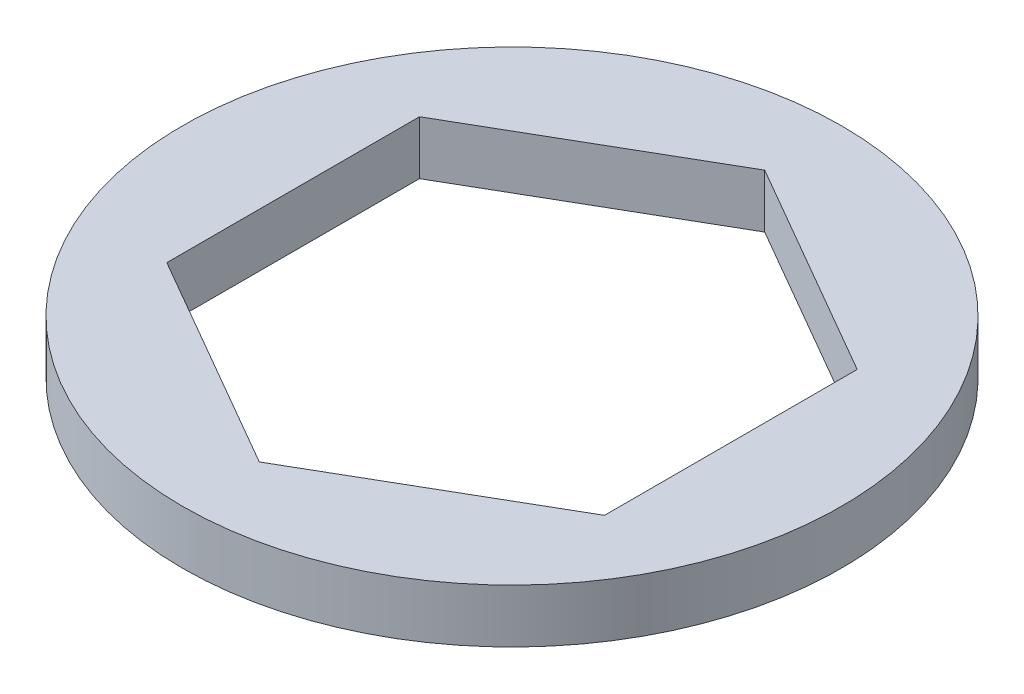
ISO-10303-21;
HEADER;
FILE_DESCRIPTION(('STEP AP214'),'2;1');
FILE_NAME('part.step','',(''),(''),'','','');
FILE_SCHEMA(('AUTOMOTIVE_DESIGN { 1 0 10303 214 1 1 1 1 }'));
ENDSEC;
DATA;
#1=APPLICATION_CONTEXT('core data for automotive mechanical design processes');
#2=APPLICATION_PROTOCOL_DEFINITION('international standard','automotive_design',2000,#1);
#3=PRODUCT_CONTEXT('',#1,'mechanical');
#4=PRODUCT('Part','Part','',(#3));
#5=PRODUCT_RELATED_PRODUCT_CATEGORY('part','',(#4));
#6=PRODUCT_DEFINITION_FORMATION('','',#4);
#7=PRODUCT_DEFINITION_CONTEXT('part definition',#1,'design');
#8=PRODUCT_DEFINITION('design','',#6,#7);
#9=PRODUCT_DEFINITION_SHAPE('','',#8);
#10=(LENGTH_UNIT() NAMED_UNIT(*) SI_UNIT(.MILLI.,.METRE.));
#11=(NAMED_UNIT(*) PLANE_ANGLE_UNIT() SI_UNIT($,.RADIAN.));
#12=(NAMED_UNIT(*) SI_UNIT($,.STERADIAN.) SOLID_ANGLE_UNIT());
#13=UNCERTAINTY_MEASURE_WITH_UNIT(LENGTH_MEASURE(1.E-05),#10,'distance_accuracy_value','');
#14=(GEOMETRIC_REPRESENTATION_CONTEXT(3) GLOBAL_UNCERTAINTY_ASSIGNED_CONTEXT((#13)) GLOBAL_UNIT_ASSIGNED_CONTEXT((#10,
#11,#12)) REPRESENTATION_CONTEXT('',''));
#15=CARTESIAN_POINT('',(0.,0.,0.));
#16=DIRECTION('',(0.,0.,1.));
#17=DIRECTION('',(1.,0.,0.));
#18=AXIS2_PLACEMENT_3D('',#15,#16,#17);
#19=CARTESIAN_POINT('',(0.,1.5875,0.));
#20=DIRECTION('',(0.,1.,0.));
#21=DIRECTION('',(0.,0.,1.));
#22=AXIS2_PLACEMENT_3D('',#19,#20,#21);
#23=PLANE('',#22);
#24=CARTESIAN_POINT('',(0.,1.5875,0.));
#25=DIRECTION('',(0.,1.,0.));
#26=DIRECTION('',(0.,0.,1.));
#27=AXIS2_PLACEMENT_3D('',#24,#25,#26);
#28=CIRCLE('',#27,9.7536);
#29=CARTESIAN_POINT('',(0.,1.5875,9.7536));
#30=VERTEX_POINT('',#29);
#31=EDGE_CURVE('E11',#30,#30,#28,.T.);
#32=ORIENTED_EDGE('',*,*,#31,.T.);
#33=EDGE_LOOP('',(#32));
#34=FACE_BOUND('',#33,.T.);
#35=DIRECTION('',(-0.866025403784438,0.,0.500000000000001));
#36=VECTOR('',#35,1.);
#37=CARTESIAN_POINT('',(0.,1.5875,-7.4789953870824));
#38=LINE('',#37,#36);
#39=CARTESIAN_POINT('',(0.,1.5875,-7.4789953870824));
#40=VERTEX_POINT('',#39);
#41=CARTESIAN_POINT('',(-6.477,1.5875,-3.73949769354119));
#42=VERTEX_POINT('',#41);
#43=EDGE_CURVE('E93',#40,#42,#38,.T.);
#44=ORIENTED_EDGE('',*,*,#43,.F.);
#45=DIRECTION('',(-0.866025403784441,0.,-0.499999999999995));
#46=VECTOR('',#45,1.);
#47=CARTESIAN_POINT('',(6.47699999999995,1.5875,-3.73949769354128));
#48=LINE('',#47,#46);
#49=CARTESIAN_POINT('',(6.47699999999995,1.5875,-3.73949769354128));
#50=VERTEX_POINT('',#49);
#51=EDGE_CURVE('E85',#50,#40,#48,.T.);
#52=ORIENTED_EDGE('',*,*,#51,.F.);
#53=DIRECTION('',(0.,0.,-1.));
#54=VECTOR('',#53,1.);
#55=CARTESIAN_POINT('',(6.47700000000003,1.5875,3.73949769354114));
#56=LINE('',#55,#54);
#57=CARTESIAN_POINT('',(6.47700000000003,1.5875,3.73949769354114));
#58=VERTEX_POINT('',#57);
#59=EDGE_CURVE('E113',#58,#50,#56,.T.);
#60=ORIENTED_EDGE('',*,*,#59,.F.);
#61=DIRECTION('',(0.866025403784434,0.,-0.500000000000007));
#62=VECTOR('',#61,1.);
#63=CARTESIAN_POINT('',(0.,1.5875,7.4789953870824));
#64=LINE('',#63,#62);
#65=CARTESIAN_POINT('',(0.,1.5875,7.4789953870824));
#66=VERTEX_POINT('',#65);
#67=EDGE_CURVE('E111',#66,#58,#64,.T.);
#68=ORIENTED_EDGE('',*,*,#67,.F.);
#69=DIRECTION('',(0.866025403784441,0.,0.499999999999995));
#70=VECTOR('',#69,1.);
#71=CARTESIAN_POINT('',(-6.47699999999997,1.5875,3.73949769354123));
#72=LINE('',#71,#70);
#73=CARTESIAN_POINT('',(-6.47699999999997,1.5875,3.73949769354123));
#74=VERTEX_POINT('',#73);
#75=EDGE_CURVE('E107',#74,#66,#72,.T.);
#76=ORIENTED_EDGE('',*,*,#75,.F.);
#77=DIRECTION('',(0.,0.,1.));
#78=VECTOR('',#77,1.);
#79=CARTESIAN_POINT('',(-6.477,1.5875,-3.73949769354119));
#80=LINE('',#79,#78);
#81=EDGE_CURVE('E105',#42,#74,#80,.T.);
#82=ORIENTED_EDGE('',*,*,#81,.F.);
#83=EDGE_LOOP('',(#44,#52,#60,#68,#76,#82));
#84=FACE_BOUND('',#83,.T.);
#85=ADVANCED_FACE('F32',(#34,#84),#23,.T.);
#86=CARTESIAN_POINT('',(0.,0.,0.));
#87=DIRECTION('',(0.,1.,0.));
#88=DIRECTION('',(0.,0.,1.));
#89=AXIS2_PLACEMENT_3D('',#86,#87,#88);
#90=PLANE('',#89);
#91=CARTESIAN_POINT('',(0.,0.,0.));
#92=DIRECTION('',(0.,1.,0.));
#93=DIRECTION('',(0.,0.,1.));
#94=AXIS2_PLACEMENT_3D('',#91,#92,#93);
#95=CIRCLE('',#94,9.7536);
#96=CARTESIAN_POINT('',(0.,0.,9.7536));
#97=VERTEX_POINT('',#96);
#98=EDGE_CURVE('E36',#97,#97,#95,.T.);
#99=ORIENTED_EDGE('',*,*,#98,.F.);
#100=EDGE_LOOP('',(#99));
#101=FACE_BOUND('',#100,.T.);
#102=DIRECTION('',(-0.866025403784441,0.,-0.499999999999995));
#103=VECTOR('',#102,1.);
#104=CARTESIAN_POINT('',(6.47699999999995,0.,-3.73949769354128));
#105=LINE('',#104,#103);
#106=CARTESIAN_POINT('',(6.47699999999995,0.,-3.73949769354128));
#107=VERTEX_POINT('',#106);
#108=CARTESIAN_POINT('',(0.,0.,-7.4789953870824));
#109=VERTEX_POINT('',#108);
#110=EDGE_CURVE('E55',#107,#109,#105,.T.);
#111=ORIENTED_EDGE('',*,*,#110,.T.);
#112=DIRECTION('',(-0.866025403784438,0.,0.500000000000001));
#113=VECTOR('',#112,1.);
#114=CARTESIAN_POINT('',(0.,0.,-7.4789953870824));
#115=LINE('',#114,#113);
#116=CARTESIAN_POINT('',(-6.477,0.,-3.73949769354119));
#117=VERTEX_POINT('',#116);
#118=EDGE_CURVE('E100',#109,#117,#115,.T.);
#119=ORIENTED_EDGE('',*,*,#118,.T.);
#120=DIRECTION('',(0.,0.,1.));
#121=VECTOR('',#120,1.);
#122=CARTESIAN_POINT('',(-6.477,0.,-3.73949769354119));
#123=LINE('',#122,#121);
#124=CARTESIAN_POINT('',(-6.47699999999997,0.,3.73949769354123));
#125=VERTEX_POINT('',#124);
#126=EDGE_CURVE('E117',#117,#125,#123,.T.);
#127=ORIENTED_EDGE('',*,*,#126,.T.);
#128=DIRECTION('',(0.866025403784441,0.,0.499999999999995));
#129=VECTOR('',#128,1.);
#130=CARTESIAN_POINT('',(-6.47699999999997,0.,3.73949769354123));
#131=LINE('',#130,#129);
#132=CARTESIAN_POINT('',(0.,0.,7.4789953870824));
#133=VERTEX_POINT('',#132);
#134=EDGE_CURVE('E120',#125,#133,#131,.T.);
#135=ORIENTED_EDGE('',*,*,#134,.T.);
#136=DIRECTION('',(0.866025403784434,0.,-0.500000000000007));
#137=VECTOR('',#136,1.);
#138=CARTESIAN_POINT('',(0.,0.,7.4789953870824));
#139=LINE('',#138,#137);
#140=CARTESIAN_POINT('',(6.47700000000003,0.,3.73949769354114));
#141=VERTEX_POINT('',#140);
#142=EDGE_CURVE('E123',#133,#141,#139,.T.);
#143=ORIENTED_EDGE('',*,*,#142,.T.);
#144=DIRECTION('',(0.,0.,-1.));
#145=VECTOR('',#144,1.);
#146=CARTESIAN_POINT('',(6.47700000000003,0.,3.73949769354114));
#147=LINE('',#146,#145);
#148=EDGE_CURVE('E94',#141,#107,#147,.T.);
#149=ORIENTED_EDGE('',*,*,#148,.T.);
#150=EDGE_LOOP('',(#111,#119,#127,#135,#143,#149));
#151=FACE_BOUND('',#150,.T.);
#152=ADVANCED_FACE('F140',(#101,#151),#90,.F.);
#153=CARTESIAN_POINT('',(0.,1.5875,0.));
#154=DIRECTION('',(0.,-1.,0.));
#155=DIRECTION('',(0.,0.,-1.));
#156=AXIS2_PLACEMENT_3D('',#153,#154,#155);
#157=CYLINDRICAL_SURFACE('',#156,9.7536);
#158=ORIENTED_EDGE('',*,*,#31,.F.);
#159=EDGE_LOOP('',(#158));
#160=FACE_BOUND('',#159,.T.);
#161=ORIENTED_EDGE('',*,*,#98,.T.);
#162=EDGE_LOOP('',(#161));
#163=FACE_BOUND('',#162,.T.);
#164=ADVANCED_FACE('F34',(#160,#163),#157,.T.);
#165=CARTESIAN_POINT('',(6.47699999999995,1.5875,-3.73949769354128));
#166=DIRECTION('',(-0.499999999999995,0.,0.866025403784442));
#167=DIRECTION('',(0.866025403784442,0.,0.499999999999995));
#168=AXIS2_PLACEMENT_3D('',#165,#166,#167);
#169=PLANE('',#168);
#170=ORIENTED_EDGE('',*,*,#110,.F.);
#171=DIRECTION('',(0.,-1.,0.));
#172=VECTOR('',#171,1.);
#173=CARTESIAN_POINT('',(6.47699999999995,1.5875,-3.73949769354128));
#174=LINE('',#173,#172);
#175=EDGE_CURVE('E89',#50,#107,#174,.T.);
#176=ORIENTED_EDGE('',*,*,#175,.F.);
#177=ORIENTED_EDGE('',*,*,#51,.T.);
#178=DIRECTION('',(0.,-1.,0.));
#179=VECTOR('',#178,1.);
#180=CARTESIAN_POINT('',(0.,1.5875,-7.4789953870824));
#181=LINE('',#180,#179);
#182=EDGE_CURVE('E88',#40,#109,#181,.T.);
#183=ORIENTED_EDGE('',*,*,#182,.T.);
#184=EDGE_LOOP('',(#170,#176,#177,#183));
#185=FACE_BOUND('',#184,.T.);
#186=ADVANCED_FACE('F87',(#185),#169,.T.);
#187=CARTESIAN_POINT('',(0.,1.5875,-7.4789953870824));
#188=DIRECTION('',(0.500000000000001,0.,0.866025403784438));
#189=DIRECTION('',(0.866025403784438,0.,-0.500000000000001));
#190=AXIS2_PLACEMENT_3D('',#187,#188,#189);
#191=PLANE('',#190);
#192=ORIENTED_EDGE('',*,*,#118,.F.);
#193=ORIENTED_EDGE('',*,*,#182,.F.);
#194=ORIENTED_EDGE('',*,*,#43,.T.);
#195=DIRECTION('',(0.,-1.,0.));
#196=VECTOR('',#195,1.);
#197=CARTESIAN_POINT('',(-6.477,1.5875,-3.73949769354119));
#198=LINE('',#197,#196);
#199=EDGE_CURVE('E101',#42,#117,#198,.T.);
#200=ORIENTED_EDGE('',*,*,#199,.T.);
#201=EDGE_LOOP('',(#192,#193,#194,#200));
#202=FACE_BOUND('',#201,.T.);
#203=ADVANCED_FACE('F97',(#202),#191,.T.);
#204=CARTESIAN_POINT('',(-6.477,1.5875,-3.73949769354119));
#205=DIRECTION('',(1.,0.,0.));
#206=DIRECTION('',(0.,0.,-1.));
#207=AXIS2_PLACEMENT_3D('',#204,#205,#206);
#208=PLANE('',#207);
#209=ORIENTED_EDGE('',*,*,#126,.F.);
#210=ORIENTED_EDGE('',*,*,#199,.F.);
#211=ORIENTED_EDGE('',*,*,#81,.T.);
#212=DIRECTION('',(0.,-1.,0.));
#213=VECTOR('',#212,1.);
#214=CARTESIAN_POINT('',(-6.47699999999997,1.5875,3.73949769354123));
#215=LINE('',#214,#213);
#216=EDGE_CURVE('E132',#74,#125,#215,.T.);
#217=ORIENTED_EDGE('',*,*,#216,.T.);
#218=EDGE_LOOP('',(#209,#210,#211,#217));
#219=FACE_BOUND('',#218,.T.);
#220=ADVANCED_FACE('F136',(#219),#208,.T.);
#221=CARTESIAN_POINT('',(-6.47699999999997,1.5875,3.73949769354123));
#222=DIRECTION('',(0.499999999999995,0.,-0.866025403784442));
#223=DIRECTION('',(-0.866025403784442,0.,-0.499999999999995));
#224=AXIS2_PLACEMENT_3D('',#221,#222,#223);
#225=PLANE('',#224);
#226=ORIENTED_EDGE('',*,*,#134,.F.);
#227=ORIENTED_EDGE('',*,*,#216,.F.);
#228=ORIENTED_EDGE('',*,*,#75,.T.);
#229=DIRECTION('',(0.,-1.,0.));
#230=VECTOR('',#229,1.);
#231=CARTESIAN_POINT('',(0.,1.5875,7.4789953870824));
#232=LINE('',#231,#230);
#233=EDGE_CURVE('E130',#66,#133,#232,.T.);
#234=ORIENTED_EDGE('',*,*,#233,.T.);
#235=EDGE_LOOP('',(#226,#227,#228,#234));
#236=FACE_BOUND('',#235,.T.);
#237=ADVANCED_FACE('F148',(#236),#225,.T.);
#238=CARTESIAN_POINT('',(0.,1.5875,7.4789953870824));
#239=DIRECTION('',(-0.500000000000007,0.,-0.866025403784435));
#240=DIRECTION('',(-0.866025403784435,0.,0.500000000000007));
#241=AXIS2_PLACEMENT_3D('',#238,#239,#240);
#242=PLANE('',#241);
#243=ORIENTED_EDGE('',*,*,#142,.F.);
#244=ORIENTED_EDGE('',*,*,#233,.F.);
#245=ORIENTED_EDGE('',*,*,#67,.T.);
#246=DIRECTION('',(0.,-1.,0.));
#247=VECTOR('',#246,1.);
#248=CARTESIAN_POINT('',(6.47700000000003,1.5875,3.73949769354114));
#249=LINE('',#248,#247);
#250=EDGE_CURVE('E47',#58,#141,#249,.T.);
#251=ORIENTED_EDGE('',*,*,#250,.T.);
#252=EDGE_LOOP('',(#243,#244,#245,#251));
#253=FACE_BOUND('',#252,.T.);
#254=ADVANCED_FACE('F146',(#253),#242,.T.);
#255=CARTESIAN_POINT('',(6.47700000000003,1.5875,3.73949769354114));
#256=DIRECTION('',(-1.,0.,0.));
#257=DIRECTION('',(0.,0.,1.));
#258=AXIS2_PLACEMENT_3D('',#255,#256,#257);
#259=PLANE('',#258);
#260=ORIENTED_EDGE('',*,*,#148,.F.);
#261=ORIENTED_EDGE('',*,*,#250,.F.);
#262=ORIENTED_EDGE('',*,*,#59,.T.);
#263=ORIENTED_EDGE('',*,*,#175,.T.);
#264=EDGE_LOOP('',(#260,#261,#262,#263));
#265=FACE_BOUND('',#264,.T.);
#266=ADVANCED_FACE('F142',(#265),#259,.T.);
#267=CLOSED_SHELL('',(#85,#152,#164,#186,#203,#220,#237,#254,#266));
#268=MANIFOLD_SOLID_BREP('B2',#267);
#269=ADVANCED_BREP_SHAPE_REPRESENTATION('',(#18,#268),#14);
#270=SHAPE_DEFINITION_REPRESENTATION(#9,#269);
ENDSEC;
END-ISO-10303-21;
